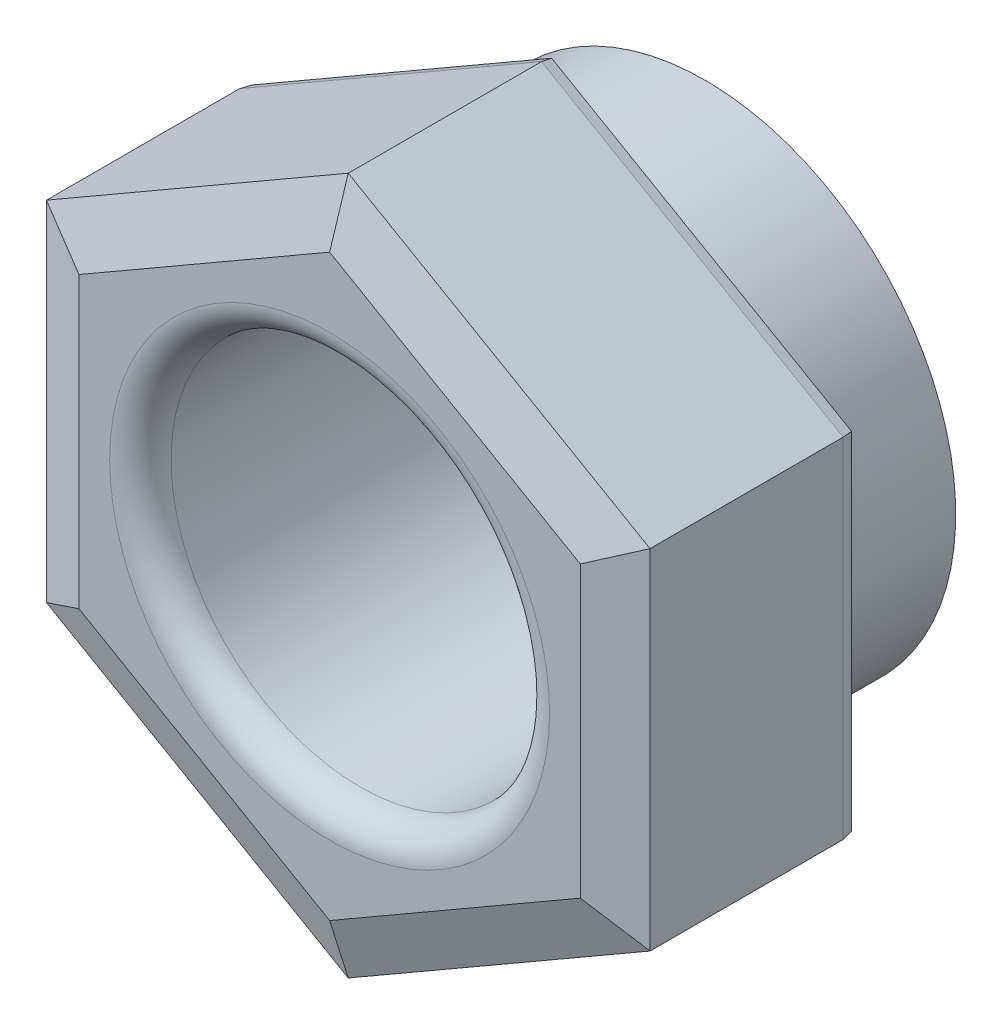
ISO-10303-21;
HEADER;
FILE_DESCRIPTION(('STEP AP214'),'2;1');
FILE_NAME('part.step','',(''),(''),'','','');
FILE_SCHEMA(('AUTOMOTIVE_DESIGN { 1 0 10303 214 1 1 1 1 }'));
ENDSEC;
DATA;
#1=APPLICATION_CONTEXT('core data for automotive mechanical design processes');
#2=APPLICATION_PROTOCOL_DEFINITION('international standard','automotive_design',2000,#1);
#3=PRODUCT_CONTEXT('',#1,'mechanical');
#4=PRODUCT('Part','Part','',(#3));
#5=PRODUCT_RELATED_PRODUCT_CATEGORY('part','',(#4));
#6=PRODUCT_DEFINITION_FORMATION('','',#4);
#7=PRODUCT_DEFINITION_CONTEXT('part definition',#1,'design');
#8=PRODUCT_DEFINITION('design','',#6,#7);
#9=PRODUCT_DEFINITION_SHAPE('','',#8);
#10=(LENGTH_UNIT() NAMED_UNIT(*) SI_UNIT(.MILLI.,.METRE.));
#11=(NAMED_UNIT(*) PLANE_ANGLE_UNIT() SI_UNIT($,.RADIAN.));
#12=(NAMED_UNIT(*) SI_UNIT($,.STERADIAN.) SOLID_ANGLE_UNIT());
#13=UNCERTAINTY_MEASURE_WITH_UNIT(LENGTH_MEASURE(1.E-05),#10,'distance_accuracy_value','');
#14=(GEOMETRIC_REPRESENTATION_CONTEXT(3) GLOBAL_UNCERTAINTY_ASSIGNED_CONTEXT((#13)) GLOBAL_UNIT_ASSIGNED_CONTEXT((#10,
#11,#12)) REPRESENTATION_CONTEXT('',''));
#15=CARTESIAN_POINT('',(0.,0.,0.));
#16=DIRECTION('',(0.,0.,1.));
#17=DIRECTION('',(1.,0.,0.));
#18=AXIS2_PLACEMENT_3D('',#15,#16,#17);
#19=CARTESIAN_POINT('',(-14.75,-8.51591647054699,18.35));
#20=DIRECTION('',(0.5,0.866025403784439,0.));
#21=DIRECTION('',(-0.866025403784439,0.5,0.));
#22=AXIS2_PLACEMENT_3D('',#19,#20,#21);
#23=PLANE('',#22);
#24=DIRECTION('',(0.,0.,-1.));
#25=VECTOR('',#24,1.);
#26=CARTESIAN_POINT('',(0.,-17.031832941094,18.35));
#27=LINE('',#26,#25);
#28=CARTESIAN_POINT('',(0.,-17.031832941094,17.4400744143345));
#29=VERTEX_POINT('',#28);
#30=CARTESIAN_POINT('',(0.,-17.031832941094,8.00000000000001));
#31=VERTEX_POINT('',#30);
#32=EDGE_CURVE('E320',#29,#31,#27,.T.);
#33=ORIENTED_EDGE('',*,*,#32,.F.);
#34=DIRECTION('',(-0.866025403784439,0.5,0.));
#35=VECTOR('',#34,1.);
#36=CARTESIAN_POINT('',(-14.75,-8.51591647054699,17.4400744143345));
#37=LINE('',#36,#35);
#38=CARTESIAN_POINT('',(-14.75,-8.51591647054699,17.4400744143345));
#39=VERTEX_POINT('',#38);
#40=EDGE_CURVE('E213',#29,#39,#37,.T.);
#41=ORIENTED_EDGE('',*,*,#40,.T.);
#42=DIRECTION('',(0.,0.,-1.));
#43=VECTOR('',#42,1.);
#44=CARTESIAN_POINT('',(-14.75,-8.51591647054699,18.35));
#45=LINE('',#44,#43);
#46=CARTESIAN_POINT('',(-14.75,-8.51591647054699,8.00000000000001));
#47=VERTEX_POINT('',#46);
#48=EDGE_CURVE('E319',#39,#47,#45,.T.);
#49=ORIENTED_EDGE('',*,*,#48,.T.);
#50=DIRECTION('',(0.866025403784439,-0.5,0.));
#51=VECTOR('',#50,1.);
#52=CARTESIAN_POINT('',(0.,-17.031832941094,8.00000000000002));
#53=LINE('',#52,#51);
#54=EDGE_CURVE('E165',#47,#31,#53,.T.);
#55=ORIENTED_EDGE('',*,*,#54,.T.);
#56=EDGE_LOOP('',(#33,#41,#49,#55));
#57=FACE_BOUND('',#56,.T.);
#58=ADVANCED_FACE('F31',(#57),#23,.F.);
#59=CARTESIAN_POINT('',(0.,-17.031832941094,18.35));
#60=DIRECTION('',(-0.5,0.866025403784439,0.));
#61=DIRECTION('',(-0.866025403784439,-0.5,0.));
#62=AXIS2_PLACEMENT_3D('',#59,#60,#61);
#63=PLANE('',#62);
#64=DIRECTION('',(0.,0.,-1.));
#65=VECTOR('',#64,1.);
#66=CARTESIAN_POINT('',(14.75,-8.51591647054699,18.35));
#67=LINE('',#66,#65);
#68=CARTESIAN_POINT('',(14.75,-8.51591647054699,17.4400744143345));
#69=VERTEX_POINT('',#68);
#70=CARTESIAN_POINT('',(14.75,-8.51591647054699,8.00000000000001));
#71=VERTEX_POINT('',#70);
#72=EDGE_CURVE('E336',#69,#71,#67,.T.);
#73=ORIENTED_EDGE('',*,*,#72,.F.);
#74=DIRECTION('',(-0.866025403784439,-0.5,0.));
#75=VECTOR('',#74,1.);
#76=CARTESIAN_POINT('',(0.,-17.031832941094,17.4400744143345));
#77=LINE('',#76,#75);
#78=EDGE_CURVE('E215',#69,#29,#77,.T.);
#79=ORIENTED_EDGE('',*,*,#78,.T.);
#80=ORIENTED_EDGE('',*,*,#32,.T.);
#81=DIRECTION('',(0.866025403784439,0.5,0.));
#82=VECTOR('',#81,1.);
#83=CARTESIAN_POINT('',(14.75,-8.51591647054699,8.00000000000001));
#84=LINE('',#83,#82);
#85=EDGE_CURVE('E162',#31,#71,#84,.T.);
#86=ORIENTED_EDGE('',*,*,#85,.T.);
#87=EDGE_LOOP('',(#73,#79,#80,#86));
#88=FACE_BOUND('',#87,.T.);
#89=ADVANCED_FACE('F250',(#88),#63,.F.);
#90=CARTESIAN_POINT('',(14.75,-8.51591647054699,18.35));
#91=DIRECTION('',(-1.,0.,0.));
#92=DIRECTION('',(0.,-1.,0.));
#93=AXIS2_PLACEMENT_3D('',#90,#91,#92);
#94=PLANE('',#93);
#95=DIRECTION('',(0.,0.,-1.));
#96=VECTOR('',#95,1.);
#97=CARTESIAN_POINT('',(14.75,8.51591647054698,18.35));
#98=LINE('',#97,#96);
#99=CARTESIAN_POINT('',(14.75,8.51591647054698,17.4400744143345));
#100=VERTEX_POINT('',#99);
#101=CARTESIAN_POINT('',(14.75,8.51591647054698,8.00000000000001));
#102=VERTEX_POINT('',#101);
#103=EDGE_CURVE('E334',#100,#102,#98,.T.);
#104=ORIENTED_EDGE('',*,*,#103,.F.);
#105=DIRECTION('',(0.,-1.,0.));
#106=VECTOR('',#105,1.);
#107=CARTESIAN_POINT('',(14.75,-8.51591647054699,17.4400744143345));
#108=LINE('',#107,#106);
#109=EDGE_CURVE('E53',#100,#69,#108,.T.);
#110=ORIENTED_EDGE('',*,*,#109,.T.);
#111=ORIENTED_EDGE('',*,*,#72,.T.);
#112=DIRECTION('',(0.,1.,0.));
#113=VECTOR('',#112,1.);
#114=CARTESIAN_POINT('',(14.75,8.51591647054698,8.00000000000001));
#115=LINE('',#114,#113);
#116=EDGE_CURVE('E175',#71,#102,#115,.T.);
#117=ORIENTED_EDGE('',*,*,#116,.T.);
#118=EDGE_LOOP('',(#104,#110,#111,#117));
#119=FACE_BOUND('',#118,.T.);
#120=ADVANCED_FACE('F256',(#119),#94,.F.);
#121=CARTESIAN_POINT('',(14.75,8.51591647054698,18.35));
#122=DIRECTION('',(-0.5,-0.866025403784439,0.));
#123=DIRECTION('',(0.866025403784439,-0.5,0.));
#124=AXIS2_PLACEMENT_3D('',#121,#122,#123);
#125=PLANE('',#124);
#126=DIRECTION('',(0.,0.,-1.));
#127=VECTOR('',#126,1.);
#128=CARTESIAN_POINT('',(0.,17.031832941094,18.35));
#129=LINE('',#128,#127);
#130=CARTESIAN_POINT('',(0.,17.031832941094,17.4400744143345));
#131=VERTEX_POINT('',#130);
#132=CARTESIAN_POINT('',(0.,17.031832941094,8.00000000000001));
#133=VERTEX_POINT('',#132);
#134=EDGE_CURVE('E328',#131,#133,#129,.T.);
#135=ORIENTED_EDGE('',*,*,#134,.F.);
#136=DIRECTION('',(0.866025403784439,-0.5,0.));
#137=VECTOR('',#136,1.);
#138=CARTESIAN_POINT('',(14.75,8.51591647054698,17.4400744143345));
#139=LINE('',#138,#137);
#140=EDGE_CURVE('E46',#131,#100,#139,.T.);
#141=ORIENTED_EDGE('',*,*,#140,.T.);
#142=ORIENTED_EDGE('',*,*,#103,.T.);
#143=DIRECTION('',(-0.866025403784439,0.5,0.));
#144=VECTOR('',#143,1.);
#145=CARTESIAN_POINT('',(0.,17.031832941094,8.00000000000002));
#146=LINE('',#145,#144);
#147=EDGE_CURVE('E138',#102,#133,#146,.T.);
#148=ORIENTED_EDGE('',*,*,#147,.T.);
#149=EDGE_LOOP('',(#135,#141,#142,#148));
#150=FACE_BOUND('',#149,.T.);
#151=ADVANCED_FACE('F368',(#150),#125,.F.);
#152=CARTESIAN_POINT('',(0.,17.031832941094,18.35));
#153=DIRECTION('',(0.5,-0.866025403784439,0.));
#154=DIRECTION('',(0.866025403784439,0.5,0.));
#155=AXIS2_PLACEMENT_3D('',#152,#153,#154);
#156=PLANE('',#155);
#157=DIRECTION('',(0.,0.,-1.));
#158=VECTOR('',#157,1.);
#159=CARTESIAN_POINT('',(-14.75,8.51591647054699,18.35));
#160=LINE('',#159,#158);
#161=CARTESIAN_POINT('',(-14.75,8.51591647054699,17.4400744143345));
#162=VERTEX_POINT('',#161);
#163=CARTESIAN_POINT('',(-14.75,8.51591647054699,8.00000000000001));
#164=VERTEX_POINT('',#163);
#165=EDGE_CURVE('E326',#162,#164,#160,.T.);
#166=ORIENTED_EDGE('',*,*,#165,.F.);
#167=DIRECTION('',(0.866025403784439,0.5,0.));
#168=VECTOR('',#167,1.);
#169=CARTESIAN_POINT('',(0.,17.031832941094,17.4400744143345));
#170=LINE('',#169,#168);
#171=EDGE_CURVE('E208',#162,#131,#170,.T.);
#172=ORIENTED_EDGE('',*,*,#171,.T.);
#173=ORIENTED_EDGE('',*,*,#134,.T.);
#174=DIRECTION('',(-0.866025403784439,-0.5,0.));
#175=VECTOR('',#174,1.);
#176=CARTESIAN_POINT('',(-14.75,8.51591647054699,8.00000000000002));
#177=LINE('',#176,#175);
#178=EDGE_CURVE('E171',#133,#164,#177,.T.);
#179=ORIENTED_EDGE('',*,*,#178,.T.);
#180=EDGE_LOOP('',(#166,#172,#173,#179));
#181=FACE_BOUND('',#180,.T.);
#182=ADVANCED_FACE('F365',(#181),#156,.F.);
#183=CARTESIAN_POINT('',(-14.75,8.51591647054699,18.35));
#184=DIRECTION('',(1.,0.,0.));
#185=DIRECTION('',(0.,1.,0.));
#186=AXIS2_PLACEMENT_3D('',#183,#184,#185);
#187=PLANE('',#186);
#188=ORIENTED_EDGE('',*,*,#48,.F.);
#189=DIRECTION('',(0.,1.,0.));
#190=VECTOR('',#189,1.);
#191=CARTESIAN_POINT('',(-14.75,8.51591647054699,17.4400744143345));
#192=LINE('',#191,#190);
#193=EDGE_CURVE('E211',#39,#162,#192,.T.);
#194=ORIENTED_EDGE('',*,*,#193,.T.);
#195=ORIENTED_EDGE('',*,*,#165,.T.);
#196=DIRECTION('',(0.,-1.,0.));
#197=VECTOR('',#196,1.);
#198=CARTESIAN_POINT('',(-14.75,-8.51591647054699,8.00000000000001));
#199=LINE('',#198,#197);
#200=EDGE_CURVE('E168',#164,#47,#199,.T.);
#201=ORIENTED_EDGE('',*,*,#200,.T.);
#202=EDGE_LOOP('',(#188,#194,#195,#201));
#203=FACE_BOUND('',#202,.T.);
#204=ADVANCED_FACE('F322',(#203),#187,.F.);
#205=CARTESIAN_POINT('',(0.,-17.031832941094,0.));
#206=DIRECTION('',(0.,0.,1.));
#207=DIRECTION('',(1.,0.,0.));
#208=AXIS2_PLACEMENT_3D('',#205,#206,#207);
#209=PLANE('',#208);
#210=CARTESIAN_POINT('',(0.,0.,0.));
#211=DIRECTION('',(0.,0.,1.));
#212=DIRECTION('',(1.,0.,0.));
#213=AXIS2_PLACEMENT_3D('',#210,#211,#212);
#214=CIRCLE('',#213,11.25);
#215=CARTESIAN_POINT('',(11.25,0.,0.));
#216=VERTEX_POINT('',#215);
#217=EDGE_CURVE('E151',#216,#216,#214,.T.);
#218=ORIENTED_EDGE('',*,*,#217,.T.);
#219=EDGE_LOOP('',(#218));
#220=FACE_BOUND('',#219,.T.);
#221=CARTESIAN_POINT('',(0.,0.,0.));
#222=DIRECTION('',(0.,0.,-1.));
#223=DIRECTION('',(-1.,0.,0.));
#224=AXIS2_PLACEMENT_3D('',#221,#222,#223);
#225=CIRCLE('',#224,12.25);
#226=CARTESIAN_POINT('',(-12.25,0.,0.));
#227=VERTEX_POINT('',#226);
#228=EDGE_CURVE('E189',#227,#227,#225,.T.);
#229=ORIENTED_EDGE('',*,*,#228,.T.);
#230=EDGE_LOOP('',(#229));
#231=FACE_BOUND('',#230,.T.);
#232=ADVANCED_FACE('F341',(#220,#231),#209,.F.);
#233=CARTESIAN_POINT('',(0.,-17.031832941094,18.35));
#234=DIRECTION('',(0.,0.,1.));
#235=DIRECTION('',(1.,0.,0.));
#236=AXIS2_PLACEMENT_3D('',#233,#234,#235);
#237=PLANE('',#236);
#238=CARTESIAN_POINT('',(0.,0.,18.35));
#239=DIRECTION('',(0.,0.,1.));
#240=DIRECTION('',(1.,0.,0.));
#241=AXIS2_PLACEMENT_3D('',#238,#239,#240);
#242=CIRCLE('',#241,10.75);
#243=CARTESIAN_POINT('',(10.75,0.,18.35));
#244=VERTEX_POINT('',#243);
#245=EDGE_CURVE('E11',#244,#244,#242,.F.);
#246=ORIENTED_EDGE('',*,*,#245,.T.);
#247=EDGE_LOOP('',(#246));
#248=FACE_BOUND('',#247,.T.);
#249=DIRECTION('',(-0.866025403784439,0.5,0.));
#250=VECTOR('',#249,1.);
#251=CARTESIAN_POINT('',(-1.25000000000003,14.8667694316328,18.35));
#252=LINE('',#251,#250);
#253=CARTESIAN_POINT('',(12.25,7.07254079757289,18.35));
#254=VERTEX_POINT('',#253);
#255=CARTESIAN_POINT('',(0.,14.1450815951458,18.35));
#256=VERTEX_POINT('',#255);
#257=EDGE_CURVE('E197',#254,#256,#252,.T.);
#258=ORIENTED_EDGE('',*,*,#257,.T.);
#259=DIRECTION('',(-0.866025403784439,-0.5,0.));
#260=VECTOR('',#259,1.);
#261=CARTESIAN_POINT('',(-13.5,6.35085296108586,18.35));
#262=LINE('',#261,#260);
#263=CARTESIAN_POINT('',(-12.25,7.0725407975729,18.35));
#264=VERTEX_POINT('',#263);
#265=EDGE_CURVE('E205',#256,#264,#262,.T.);
#266=ORIENTED_EDGE('',*,*,#265,.T.);
#267=DIRECTION('',(0.,-1.,0.));
#268=VECTOR('',#267,1.);
#269=CARTESIAN_POINT('',(-12.25,-8.51591647054699,18.35));
#270=LINE('',#269,#268);
#271=CARTESIAN_POINT('',(-12.25,-7.0725407975729,18.35));
#272=VERTEX_POINT('',#271);
#273=EDGE_CURVE('E203',#264,#272,#270,.T.);
#274=ORIENTED_EDGE('',*,*,#273,.T.);
#275=DIRECTION('',(0.866025403784439,-0.5,0.));
#276=VECTOR('',#275,1.);
#277=CARTESIAN_POINT('',(1.25000000000002,-14.8667694316328,18.35));
#278=LINE('',#277,#276);
#279=CARTESIAN_POINT('',(0.,-14.1450815951458,18.35));
#280=VERTEX_POINT('',#279);
#281=EDGE_CURVE('E201',#272,#280,#278,.T.);
#282=ORIENTED_EDGE('',*,*,#281,.T.);
#283=DIRECTION('',(0.866025403784439,0.5,0.));
#284=VECTOR('',#283,1.);
#285=CARTESIAN_POINT('',(13.5,-6.35085296108586,18.35));
#286=LINE('',#285,#284);
#287=CARTESIAN_POINT('',(12.25,-7.0725407975729,18.35));
#288=VERTEX_POINT('',#287);
#289=EDGE_CURVE('E199',#280,#288,#286,.T.);
#290=ORIENTED_EDGE('',*,*,#289,.T.);
#291=DIRECTION('',(0.,1.,0.));
#292=VECTOR('',#291,1.);
#293=CARTESIAN_POINT('',(12.25,8.51591647054698,18.35));
#294=LINE('',#293,#292);
#295=EDGE_CURVE('E195',#288,#254,#294,.T.);
#296=ORIENTED_EDGE('',*,*,#295,.T.);
#297=EDGE_LOOP('',(#258,#266,#274,#282,#290,#296));
#298=FACE_BOUND('',#297,.T.);
#299=ADVANCED_FACE('F345',(#248,#298),#237,.T.);
#300=CARTESIAN_POINT('',(0.,0.,0.));
#301=DIRECTION('',(0.,0.,1.));
#302=DIRECTION('',(1.,0.,0.));
#303=AXIS2_PLACEMENT_3D('',#300,#301,#302);
#304=CYLINDRICAL_SURFACE('',#303,9.25);
#305=CARTESIAN_POINT('',(0.,0.,16.85));
#306=DIRECTION('',(0.,0.,1.));
#307=DIRECTION('',(1.,0.,0.));
#308=AXIS2_PLACEMENT_3D('',#305,#306,#307);
#309=CIRCLE('',#308,9.25);
#310=CARTESIAN_POINT('',(9.25,0.,16.85));
#311=VERTEX_POINT('',#310);
#312=EDGE_CURVE('E39',#311,#311,#309,.T.);
#313=ORIENTED_EDGE('',*,*,#312,.T.);
#314=EDGE_LOOP('',(#313));
#315=FACE_BOUND('',#314,.T.);
#316=CARTESIAN_POINT('',(0.,0.,2.));
#317=DIRECTION('',(0.,0.,1.));
#318=DIRECTION('',(1.,0.,0.));
#319=AXIS2_PLACEMENT_3D('',#316,#317,#318);
#320=CIRCLE('',#319,9.25);
#321=CARTESIAN_POINT('',(9.25,0.,2.));
#322=VERTEX_POINT('',#321);
#323=EDGE_CURVE('E148',#322,#322,#320,.F.);
#324=ORIENTED_EDGE('',*,*,#323,.T.);
#325=EDGE_LOOP('',(#324));
#326=FACE_BOUND('',#325,.T.);
#327=ADVANCED_FACE('F236',(#315,#326),#304,.F.);
#328=CARTESIAN_POINT('',(0.,0.,7.5));
#329=DIRECTION('',(0.,0.,-1.));
#330=DIRECTION('',(-1.,0.,0.));
#331=AXIS2_PLACEMENT_3D('',#328,#329,#330);
#332=PLANE('',#331);
#333=CARTESIAN_POINT('',(0.,0.,7.5));
#334=DIRECTION('',(0.,0.,-1.));
#335=DIRECTION('',(-1.,0.,0.));
#336=AXIS2_PLACEMENT_3D('',#333,#334,#335);
#337=CIRCLE('',#336,13.25);
#338=CARTESIAN_POINT('',(-13.25,0.,7.5));
#339=VERTEX_POINT('',#338);
#340=EDGE_CURVE('E192',#339,#339,#337,.F.);
#341=ORIENTED_EDGE('',*,*,#340,.T.);
#342=EDGE_LOOP('',(#341));
#343=FACE_BOUND('',#342,.T.);
#344=DIRECTION('',(0.,-1.,0.));
#345=VECTOR('',#344,1.);
#346=CARTESIAN_POINT('',(14.6618365096458,-8.51591647054699,7.5));
#347=LINE('',#346,#345);
#348=CARTESIAN_POINT('',(14.6618365096458,8.46501525565826,7.5));
#349=VERTEX_POINT('',#348);
#350=CARTESIAN_POINT('',(14.6618365096458,-8.46501525565827,7.5));
#351=VERTEX_POINT('',#350);
#352=EDGE_CURVE('E125',#349,#351,#347,.T.);
#353=ORIENTED_EDGE('',*,*,#352,.T.);
#354=DIRECTION('',(-0.866025403784439,-0.5,0.));
#355=VECTOR('',#354,1.);
#356=CARTESIAN_POINT('',(-0.0440817451771224,-16.9554811187609,7.5));
#357=LINE('',#356,#355);
#358=CARTESIAN_POINT('',(0.,-16.9300305113165,7.5));
#359=VERTEX_POINT('',#358);
#360=EDGE_CURVE('E160',#351,#359,#357,.T.);
#361=ORIENTED_EDGE('',*,*,#360,.T.);
#362=DIRECTION('',(-0.866025403784439,0.5,0.));
#363=VECTOR('',#362,1.);
#364=CARTESIAN_POINT('',(-14.7059182548229,-8.43956464821392,7.5));
#365=LINE('',#364,#363);
#366=CARTESIAN_POINT('',(-14.6618365096458,-8.46501525565827,7.5));
#367=VERTEX_POINT('',#366);
#368=EDGE_CURVE('E158',#359,#367,#365,.T.);
#369=ORIENTED_EDGE('',*,*,#368,.T.);
#370=DIRECTION('',(0.,1.,0.));
#371=VECTOR('',#370,1.);
#372=CARTESIAN_POINT('',(-14.6618365096458,8.51591647054699,7.5));
#373=LINE('',#372,#371);
#374=CARTESIAN_POINT('',(-14.6618365096458,8.46501525565827,7.5));
#375=VERTEX_POINT('',#374);
#376=EDGE_CURVE('E156',#367,#375,#373,.T.);
#377=ORIENTED_EDGE('',*,*,#376,.T.);
#378=DIRECTION('',(0.866025403784439,0.5,0.));
#379=VECTOR('',#378,1.);
#380=CARTESIAN_POINT('',(0.0440817451771063,16.9554811187609,7.5));
#381=LINE('',#380,#379);
#382=CARTESIAN_POINT('',(0.,16.9300305113165,7.5));
#383=VERTEX_POINT('',#382);
#384=EDGE_CURVE('E128',#375,#383,#381,.T.);
#385=ORIENTED_EDGE('',*,*,#384,.T.);
#386=DIRECTION('',(0.866025403784439,-0.5,0.));
#387=VECTOR('',#386,1.);
#388=CARTESIAN_POINT('',(14.7059182548229,8.43956464821391,7.5));
#389=LINE('',#388,#387);
#390=EDGE_CURVE('E120',#383,#349,#389,.T.);
#391=ORIENTED_EDGE('',*,*,#390,.T.);
#392=EDGE_LOOP('',(#353,#361,#369,#377,#385,#391));
#393=FACE_BOUND('',#392,.T.);
#394=ADVANCED_FACE('F122',(#343,#393),#332,.T.);
#395=CARTESIAN_POINT('',(0.,0.,7.5));
#396=DIRECTION('',(0.,0.,-1.));
#397=DIRECTION('',(-1.,0.,0.));
#398=AXIS2_PLACEMENT_3D('',#395,#396,#397);
#399=CYLINDRICAL_SURFACE('',#398,12.25);
#400=CARTESIAN_POINT('',(0.,0.,6.5));
#401=DIRECTION('',(0.,0.,-1.));
#402=DIRECTION('',(-1.,0.,0.));
#403=AXIS2_PLACEMENT_3D('',#400,#401,#402);
#404=CIRCLE('',#403,12.25);
#405=CARTESIAN_POINT('',(-12.25,0.,6.5));
#406=VERTEX_POINT('',#405);
#407=EDGE_CURVE('E178',#406,#406,#404,.T.);
#408=ORIENTED_EDGE('',*,*,#407,.T.);
#409=EDGE_LOOP('',(#408));
#410=FACE_BOUND('',#409,.T.);
#411=ORIENTED_EDGE('',*,*,#228,.F.);
#412=EDGE_LOOP('',(#411));
#413=FACE_BOUND('',#412,.T.);
#414=ADVANCED_FACE('F266',(#410,#413),#399,.T.);
#415=CARTESIAN_POINT('',(0.,0.,2.));
#416=DIRECTION('',(0.,0.,1.));
#417=DIRECTION('',(1.,0.,0.));
#418=AXIS2_PLACEMENT_3D('',#415,#416,#417);
#419=TOROIDAL_SURFACE('',#418,11.25,2.);
#420=ORIENTED_EDGE('',*,*,#323,.F.);
#421=EDGE_LOOP('',(#420));
#422=FACE_BOUND('',#421,.T.);
#423=ORIENTED_EDGE('',*,*,#217,.F.);
#424=EDGE_LOOP('',(#423));
#425=FACE_BOUND('',#424,.T.);
#426=ADVANCED_FACE('F262',(#422,#425),#419,.T.);
#427=CARTESIAN_POINT('',(-7.33091825482289,12.6975228834874,7.5));
#428=DIRECTION('',(-0.492403876506104,0.852868531952444,-0.173648177666926));
#429=DIRECTION('',(-0.866025403784439,-0.5,0.));
#430=AXIS2_PLACEMENT_3D('',#427,#428,#429);
#431=PLANE('',#430);
#432=DIRECTION('',(-0.172782012866212,0.099755741639426,0.979895488325091));
#433=VECTOR('',#432,1.);
#434=CARTESIAN_POINT('',(-14.5159335250224,8.38077812821042,6.67254305587762));
#435=LINE('',#434,#433);
#436=EDGE_CURVE('E141',#164,#375,#435,.F.);
#437=ORIENTED_EDGE('',*,*,#436,.F.);
#438=ORIENTED_EDGE('',*,*,#178,.F.);
#439=DIRECTION('',(0.,0.199511483278859,0.979895488325092));
#440=VECTOR('',#439,1.);
#441=CARTESIAN_POINT('',(0.,16.7615562564208,6.67254305587767));
#442=LINE('',#441,#440);
#443=EDGE_CURVE('E187',#383,#133,#442,.T.);
#444=ORIENTED_EDGE('',*,*,#443,.F.);
#445=ORIENTED_EDGE('',*,*,#384,.F.);
#446=EDGE_LOOP('',(#437,#438,#444,#445));
#447=FACE_BOUND('',#446,.T.);
#448=ADVANCED_FACE('F265',(#447),#431,.T.);
#449=CARTESIAN_POINT('',(7.33091825482288,12.6975228834874,7.5));
#450=DIRECTION('',(0.492403876506104,0.852868531952444,-0.173648177666926));
#451=DIRECTION('',(-0.866025403784439,0.5,0.));
#452=AXIS2_PLACEMENT_3D('',#449,#450,#451);
#453=PLANE('',#452);
#454=ORIENTED_EDGE('',*,*,#443,.T.);
#455=ORIENTED_EDGE('',*,*,#147,.F.);
#456=DIRECTION('',(0.172782012866207,0.0997557416394281,0.979895488325091));
#457=VECTOR('',#456,1.);
#458=CARTESIAN_POINT('',(14.5159335250224,8.38077812821041,6.67254305587769));
#459=LINE('',#458,#457);
#460=EDGE_CURVE('E135',#349,#102,#459,.T.);
#461=ORIENTED_EDGE('',*,*,#460,.F.);
#462=ORIENTED_EDGE('',*,*,#390,.F.);
#463=EDGE_LOOP('',(#454,#455,#461,#462));
#464=FACE_BOUND('',#463,.T.);
#465=ADVANCED_FACE('F136',(#464),#453,.T.);
#466=CARTESIAN_POINT('',(-14.6618365096458,0.,7.5));
#467=DIRECTION('',(-0.984807753012208,0.,-0.173648177666932));
#468=DIRECTION('',(-0.173648177666932,0.,0.984807753012208));
#469=AXIS2_PLACEMENT_3D('',#466,#467,#468);
#470=PLANE('',#469);
#471=ORIENTED_EDGE('',*,*,#436,.T.);
#472=ORIENTED_EDGE('',*,*,#376,.F.);
#473=DIRECTION('',(-0.172782012866212,-0.0997557416394251,0.979895488325091));
#474=VECTOR('',#473,1.);
#475=CARTESIAN_POINT('',(-14.5159335250224,-8.38077812821043,6.67254305587771));
#476=LINE('',#475,#474);
#477=EDGE_CURVE('E142',#47,#367,#476,.F.);
#478=ORIENTED_EDGE('',*,*,#477,.F.);
#479=ORIENTED_EDGE('',*,*,#200,.F.);
#480=EDGE_LOOP('',(#471,#472,#478,#479));
#481=FACE_BOUND('',#480,.T.);
#482=ADVANCED_FACE('F279',(#481),#470,.T.);
#483=CARTESIAN_POINT('',(14.6618365096458,0.,7.5));
#484=DIRECTION('',(0.984807753012209,0.,-0.173648177666927));
#485=DIRECTION('',(-0.173648177666927,0.,-0.984807753012209));
#486=AXIS2_PLACEMENT_3D('',#483,#484,#485);
#487=PLANE('',#486);
#488=ORIENTED_EDGE('',*,*,#460,.T.);
#489=ORIENTED_EDGE('',*,*,#116,.F.);
#490=DIRECTION('',(-0.172782012866207,0.0997557416394378,-0.979895488325091));
#491=VECTOR('',#490,1.);
#492=CARTESIAN_POINT('',(14.5159335250224,-8.3807781282104,6.67254305587761));
#493=LINE('',#492,#491);
#494=EDGE_CURVE('E146',#351,#71,#493,.F.);
#495=ORIENTED_EDGE('',*,*,#494,.F.);
#496=ORIENTED_EDGE('',*,*,#352,.F.);
#497=EDGE_LOOP('',(#488,#489,#495,#496));
#498=FACE_BOUND('',#497,.T.);
#499=ADVANCED_FACE('F144',(#498),#487,.T.);
#500=CARTESIAN_POINT('',(-7.33091825482288,-12.6975228834874,7.5));
#501=DIRECTION('',(-0.492403876506104,-0.852868531952444,-0.173648177666926));
#502=DIRECTION('',(0.866025403784439,-0.5,0.));
#503=AXIS2_PLACEMENT_3D('',#500,#501,#502);
#504=PLANE('',#503);
#505=ORIENTED_EDGE('',*,*,#477,.T.);
#506=ORIENTED_EDGE('',*,*,#368,.F.);
#507=DIRECTION('',(0.,-0.199511483278863,0.979895488325091));
#508=VECTOR('',#507,1.);
#509=CARTESIAN_POINT('',(0.,-16.7615562564208,6.6725430558776));
#510=LINE('',#509,#508);
#511=EDGE_CURVE('E179',#31,#359,#510,.F.);
#512=ORIENTED_EDGE('',*,*,#511,.F.);
#513=ORIENTED_EDGE('',*,*,#54,.F.);
#514=EDGE_LOOP('',(#505,#506,#512,#513));
#515=FACE_BOUND('',#514,.T.);
#516=ADVANCED_FACE('F272',(#515),#504,.T.);
#517=CARTESIAN_POINT('',(7.33091825482288,-12.6975228834874,7.5));
#518=DIRECTION('',(0.492403876506104,-0.852868531952443,-0.173648177666934));
#519=DIRECTION('',(0.866025403784439,0.5,0.));
#520=AXIS2_PLACEMENT_3D('',#517,#518,#519);
#521=PLANE('',#520);
#522=ORIENTED_EDGE('',*,*,#494,.T.);
#523=ORIENTED_EDGE('',*,*,#85,.F.);
#524=ORIENTED_EDGE('',*,*,#511,.T.);
#525=ORIENTED_EDGE('',*,*,#360,.F.);
#526=EDGE_LOOP('',(#522,#523,#524,#525));
#527=FACE_BOUND('',#526,.T.);
#528=ADVANCED_FACE('F268',(#527),#521,.T.);
#529=CARTESIAN_POINT('',(0.,0.,6.5));
#530=DIRECTION('',(0.,0.,-1.));
#531=DIRECTION('',(-1.,0.,0.));
#532=AXIS2_PLACEMENT_3D('',#529,#530,#531);
#533=TOROIDAL_SURFACE('',#532,13.25,1.);
#534=ORIENTED_EDGE('',*,*,#340,.F.);
#535=EDGE_LOOP('',(#534));
#536=FACE_BOUND('',#535,.T.);
#537=ORIENTED_EDGE('',*,*,#407,.F.);
#538=EDGE_LOOP('',(#537));
#539=FACE_BOUND('',#538,.T.);
#540=ADVANCED_FACE('F271',(#536,#539),#533,.F.);
#541=CARTESIAN_POINT('',(-1.25000000000002,-14.8667694316328,18.35));
#542=DIRECTION('',(0.171010071662833,-0.296198132726022,0.939692620785909));
#543=DIRECTION('',(0.,-0.953741925422948,-0.30062657848322));
#544=AXIS2_PLACEMENT_3D('',#541,#542,#543);
#545=PLANE('',#544);
#546=DIRECTION('',(0.,-0.953741925422948,-0.30062657848322));
#547=VECTOR('',#546,1.);
#548=CARTESIAN_POINT('',(0.,-14.801545926572,18.1430775395394));
#549=LINE('',#548,#547);
#550=EDGE_CURVE('E229',#29,#280,#549,.F.);
#551=ORIENTED_EDGE('',*,*,#550,.F.);
#552=ORIENTED_EDGE('',*,*,#78,.F.);
#553=DIRECTION('',(0.825964736070557,-0.476870962711474,-0.30062657848322));
#554=VECTOR('',#553,1.);
#555=CARTESIAN_POINT('',(16.1727520350846,-9.33734274099315,16.922235022822));
#556=LINE('',#555,#554);
#557=EDGE_CURVE('E181',#288,#69,#556,.T.);
#558=ORIENTED_EDGE('',*,*,#557,.F.);
#559=ORIENTED_EDGE('',*,*,#289,.F.);
#560=EDGE_LOOP('',(#551,#552,#558,#559));
#561=FACE_BOUND('',#560,.T.);
#562=ADVANCED_FACE('F289',(#561),#545,.T.);
#563=CARTESIAN_POINT('',(12.25,-17.031832941094,18.35));
#564=DIRECTION('',(0.342020143325666,0.,0.939692620785909));
#565=DIRECTION('',(0.939692620785909,0.,-0.342020143325666));
#566=AXIS2_PLACEMENT_3D('',#563,#564,#565);
#567=PLANE('',#566);
#568=ORIENTED_EDGE('',*,*,#557,.T.);
#569=ORIENTED_EDGE('',*,*,#109,.F.);
#570=DIRECTION('',(-0.825964736070556,-0.476870962711474,0.30062657848322));
#571=VECTOR('',#570,1.);
#572=CARTESIAN_POINT('',(2.75580304551985,1.59106363016447,21.8056050896916));
#573=LINE('',#572,#571);
#574=EDGE_CURVE('E226',#254,#100,#573,.F.);
#575=ORIENTED_EDGE('',*,*,#574,.F.);
#576=ORIENTED_EDGE('',*,*,#295,.F.);
#577=EDGE_LOOP('',(#568,#569,#575,#576));
#578=FACE_BOUND('',#577,.T.);
#579=ADVANCED_FACE('F302',(#578),#567,.T.);
#580=CARTESIAN_POINT('',(1.25000000000001,-14.8667694316328,18.35));
#581=DIRECTION('',(-0.171010071662833,-0.296198132726022,0.939692620785909));
#582=DIRECTION('',(0.,-0.953741925422948,-0.30062657848322));
#583=AXIS2_PLACEMENT_3D('',#580,#581,#582);
#584=PLANE('',#583);
#585=ORIENTED_EDGE('',*,*,#550,.T.);
#586=ORIENTED_EDGE('',*,*,#281,.F.);
#587=DIRECTION('',(-0.825964736070556,-0.476870962711475,-0.30062657848322));
#588=VECTOR('',#587,1.);
#589=CARTESIAN_POINT('',(-6.11004029291105,-3.52763340787165,20.5847625729742));
#590=LINE('',#589,#588);
#591=EDGE_CURVE('E223',#39,#272,#590,.F.);
#592=ORIENTED_EDGE('',*,*,#591,.F.);
#593=ORIENTED_EDGE('',*,*,#40,.F.);
#594=EDGE_LOOP('',(#585,#586,#592,#593));
#595=FACE_BOUND('',#594,.T.);
#596=ADVANCED_FACE('F298',(#595),#584,.T.);
#597=CARTESIAN_POINT('',(13.5,6.35085296108585,18.35));
#598=DIRECTION('',(0.171010071662833,0.296198132726022,0.939692620785909));
#599=DIRECTION('',(0.,-0.953741925422948,0.30062657848322));
#600=AXIS2_PLACEMENT_3D('',#597,#598,#599);
#601=PLANE('',#600);
#602=ORIENTED_EDGE('',*,*,#574,.T.);
#603=ORIENTED_EDGE('',*,*,#140,.F.);
#604=DIRECTION('',(0.,-0.953741925422948,0.30062657848322));
#605=VECTOR('',#604,1.);
#606=CARTESIAN_POINT('',(0.,7.05526681574329,20.5847625729742));
#607=LINE('',#606,#605);
#608=EDGE_CURVE('E221',#256,#131,#607,.F.);
#609=ORIENTED_EDGE('',*,*,#608,.F.);
#610=ORIENTED_EDGE('',*,*,#257,.F.);
#611=EDGE_LOOP('',(#602,#603,#609,#610));
#612=FACE_BOUND('',#611,.T.);
#613=ADVANCED_FACE('F294',(#612),#601,.T.);
#614=CARTESIAN_POINT('',(-12.25,-17.031832941094,18.35));
#615=DIRECTION('',(-0.342020143325666,0.,0.939692620785909));
#616=DIRECTION('',(0.939692620785909,0.,0.342020143325666));
#617=AXIS2_PLACEMENT_3D('',#614,#615,#616);
#618=PLANE('',#617);
#619=ORIENTED_EDGE('',*,*,#591,.T.);
#620=ORIENTED_EDGE('',*,*,#273,.F.);
#621=DIRECTION('',(-0.825964736070556,0.476870962711475,-0.30062657848322));
#622=VECTOR('',#621,1.);
#623=CARTESIAN_POINT('',(-2.75580304551984,1.59106363016447,21.8056050896916));
#624=LINE('',#623,#622);
#625=EDGE_CURVE('E219',#162,#264,#624,.F.);
#626=ORIENTED_EDGE('',*,*,#625,.F.);
#627=ORIENTED_EDGE('',*,*,#193,.F.);
#628=EDGE_LOOP('',(#619,#620,#626,#627));
#629=FACE_BOUND('',#628,.T.);
#630=ADVANCED_FACE('F245',(#629),#618,.T.);
#631=CARTESIAN_POINT('',(-13.5,6.35085296108585,18.35));
#632=DIRECTION('',(-0.171010071662833,0.296198132726021,0.939692620785909));
#633=DIRECTION('',(0.,-0.953741925422948,0.30062657848322));
#634=AXIS2_PLACEMENT_3D('',#631,#632,#633);
#635=PLANE('',#634);
#636=ORIENTED_EDGE('',*,*,#608,.T.);
#637=ORIENTED_EDGE('',*,*,#171,.F.);
#638=ORIENTED_EDGE('',*,*,#625,.T.);
#639=ORIENTED_EDGE('',*,*,#265,.F.);
#640=EDGE_LOOP('',(#636,#637,#638,#639));
#641=FACE_BOUND('',#640,.T.);
#642=ADVANCED_FACE('F240',(#641),#635,.T.);
#643=CARTESIAN_POINT('',(0.,0.,16.85));
#644=DIRECTION('',(0.,0.,1.));
#645=DIRECTION('',(1.,0.,0.));
#646=AXIS2_PLACEMENT_3D('',#643,#644,#645);
#647=TOROIDAL_SURFACE('',#646,10.75,1.5);
#648=ORIENTED_EDGE('',*,*,#245,.F.);
#649=EDGE_LOOP('',(#648));
#650=FACE_BOUND('',#649,.T.);
#651=ORIENTED_EDGE('',*,*,#312,.F.);
#652=EDGE_LOOP('',(#651));
#653=FACE_BOUND('',#652,.T.);
#654=ADVANCED_FACE('F33',(#650,#653),#647,.T.);
#655=CLOSED_SHELL('',(#58,#89,#120,#151,#182,#204,#232,#299,#327,#394,#414,#426,#448,#465,#482,
#499,#516,#528,#540,#562,#579,#596,#613,#630,#642,#654));
#656=MANIFOLD_SOLID_BREP('B2',#655);
#657=ADVANCED_BREP_SHAPE_REPRESENTATION('',(#18,#656),#14);
#658=SHAPE_DEFINITION_REPRESENTATION(#9,#657);
ENDSEC;
END-ISO-10303-21;
